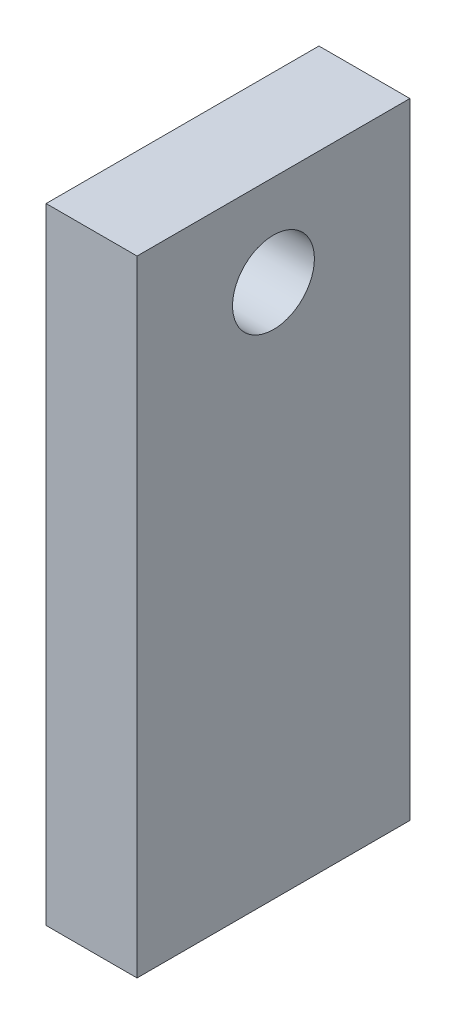
ISO-10303-21;
HEADER;
FILE_DESCRIPTION(('STEP AP214'),'2;1');
FILE_NAME('part.step','',(''),(''),'','','');
FILE_SCHEMA(('AUTOMOTIVE_DESIGN { 1 0 10303 214 1 1 1 1 }'));
ENDSEC;
DATA;
#1=APPLICATION_CONTEXT('core data for automotive mechanical design processes');
#2=APPLICATION_PROTOCOL_DEFINITION('international standard','automotive_design',2000,#1);
#3=PRODUCT_CONTEXT('',#1,'mechanical');
#4=PRODUCT('Part','Part','',(#3));
#5=PRODUCT_RELATED_PRODUCT_CATEGORY('part','',(#4));
#6=PRODUCT_DEFINITION_FORMATION('','',#4);
#7=PRODUCT_DEFINITION_CONTEXT('part definition',#1,'design');
#8=PRODUCT_DEFINITION('design','',#6,#7);
#9=PRODUCT_DEFINITION_SHAPE('','',#8);
#10=(LENGTH_UNIT() NAMED_UNIT(*) SI_UNIT(.MILLI.,.METRE.));
#11=(NAMED_UNIT(*) PLANE_ANGLE_UNIT() SI_UNIT($,.RADIAN.));
#12=(NAMED_UNIT(*) SI_UNIT($,.STERADIAN.) SOLID_ANGLE_UNIT());
#13=UNCERTAINTY_MEASURE_WITH_UNIT(LENGTH_MEASURE(1.E-05),#10,'distance_accuracy_value','');
#14=(GEOMETRIC_REPRESENTATION_CONTEXT(3) GLOBAL_UNCERTAINTY_ASSIGNED_CONTEXT((#13)) GLOBAL_UNIT_ASSIGNED_CONTEXT((#10,
#11,#12)) REPRESENTATION_CONTEXT('',''));
#15=CARTESIAN_POINT('',(0.,0.,0.));
#16=DIRECTION('',(0.,0.,1.));
#17=DIRECTION('',(1.,0.,0.));
#18=AXIS2_PLACEMENT_3D('',#15,#16,#17);
#19=CARTESIAN_POINT('',(100.,0.,0.));
#20=DIRECTION('',(1.,0.,0.));
#21=DIRECTION('',(0.,0.,-1.));
#22=AXIS2_PLACEMENT_3D('',#19,#20,#21);
#23=PLANE('',#22);
#24=DIRECTION('',(0.,-1.,0.));
#25=VECTOR('',#24,1.);
#26=CARTESIAN_POINT('',(100.,-343.75,150.));
#27=LINE('',#26,#25);
#28=CARTESIAN_POINT('',(100.,343.75,150.));
#29=VERTEX_POINT('',#28);
#30=CARTESIAN_POINT('',(100.,-343.75,150.));
#31=VERTEX_POINT('',#30);
#32=EDGE_CURVE('E100',#29,#31,#27,.T.);
#33=ORIENTED_EDGE('',*,*,#32,.T.);
#34=DIRECTION('',(0.,0.,-1.));
#35=VECTOR('',#34,1.);
#36=CARTESIAN_POINT('',(100.,-343.75,-150.));
#37=LINE('',#36,#35);
#38=CARTESIAN_POINT('',(100.,-343.75,-150.));
#39=VERTEX_POINT('',#38);
#40=EDGE_CURVE('E95',#31,#39,#37,.T.);
#41=ORIENTED_EDGE('',*,*,#40,.T.);
#42=DIRECTION('',(0.,1.,0.));
#43=VECTOR('',#42,1.);
#44=CARTESIAN_POINT('',(100.,-343.75,-150.));
#45=LINE('',#44,#43);
#46=CARTESIAN_POINT('',(100.,343.75,-150.));
#47=VERTEX_POINT('',#46);
#48=EDGE_CURVE('E98',#39,#47,#45,.T.);
#49=ORIENTED_EDGE('',*,*,#48,.T.);
#50=DIRECTION('',(0.,0.,1.));
#51=VECTOR('',#50,1.);
#52=CARTESIAN_POINT('',(100.,343.75,-150.));
#53=LINE('',#52,#51);
#54=EDGE_CURVE('E65',#47,#29,#53,.T.);
#55=ORIENTED_EDGE('',*,*,#54,.T.);
#56=EDGE_LOOP('',(#33,#41,#49,#55));
#57=FACE_BOUND('',#56,.T.);
#58=CARTESIAN_POINT('',(100.,243.75,0.));
#59=DIRECTION('',(1.,0.,0.));
#60=DIRECTION('',(0.,0.,-1.));
#61=AXIS2_PLACEMENT_3D('',#58,#59,#60);
#62=CIRCLE('',#61,45.);
#63=CARTESIAN_POINT('',(100.,243.75,-45.));
#64=VERTEX_POINT('',#63);
#65=EDGE_CURVE('E120',#64,#64,#62,.T.);
#66=ORIENTED_EDGE('',*,*,#65,.F.);
#67=EDGE_LOOP('',(#66));
#68=FACE_BOUND('',#67,.T.);
#69=ADVANCED_FACE('F47',(#57,#68),#23,.T.);
#70=CARTESIAN_POINT('',(0.,0.,0.));
#71=DIRECTION('',(1.,0.,0.));
#72=DIRECTION('',(0.,0.,-1.));
#73=AXIS2_PLACEMENT_3D('',#70,#71,#72);
#74=PLANE('',#73);
#75=DIRECTION('',(0.,-1.,0.));
#76=VECTOR('',#75,1.);
#77=CARTESIAN_POINT('',(0.,-343.75,150.));
#78=LINE('',#77,#76);
#79=CARTESIAN_POINT('',(0.,343.75,150.));
#80=VERTEX_POINT('',#79);
#81=CARTESIAN_POINT('',(0.,-343.75,150.));
#82=VERTEX_POINT('',#81);
#83=EDGE_CURVE('E116',#80,#82,#78,.T.);
#84=ORIENTED_EDGE('',*,*,#83,.F.);
#85=DIRECTION('',(0.,0.,1.));
#86=VECTOR('',#85,1.);
#87=CARTESIAN_POINT('',(0.,343.75,-150.));
#88=LINE('',#87,#86);
#89=CARTESIAN_POINT('',(0.,343.75,-150.));
#90=VERTEX_POINT('',#89);
#91=EDGE_CURVE('E88',#90,#80,#88,.T.);
#92=ORIENTED_EDGE('',*,*,#91,.F.);
#93=DIRECTION('',(0.,1.,0.));
#94=VECTOR('',#93,1.);
#95=CARTESIAN_POINT('',(0.,-343.75,-150.));
#96=LINE('',#95,#94);
#97=CARTESIAN_POINT('',(0.,-343.75,-150.));
#98=VERTEX_POINT('',#97);
#99=EDGE_CURVE('E82',#98,#90,#96,.T.);
#100=ORIENTED_EDGE('',*,*,#99,.F.);
#101=DIRECTION('',(0.,0.,-1.));
#102=VECTOR('',#101,1.);
#103=CARTESIAN_POINT('',(0.,-343.75,-150.));
#104=LINE('',#103,#102);
#105=EDGE_CURVE('E105',#82,#98,#104,.T.);
#106=ORIENTED_EDGE('',*,*,#105,.F.);
#107=EDGE_LOOP('',(#84,#92,#100,#106));
#108=FACE_BOUND('',#107,.T.);
#109=CARTESIAN_POINT('',(0.,243.75,0.));
#110=DIRECTION('',(1.,0.,0.));
#111=DIRECTION('',(0.,0.,-1.));
#112=AXIS2_PLACEMENT_3D('',#109,#110,#111);
#113=CIRCLE('',#112,45.);
#114=CARTESIAN_POINT('',(0.,243.75,-45.));
#115=VERTEX_POINT('',#114);
#116=EDGE_CURVE('E138',#115,#115,#113,.T.);
#117=ORIENTED_EDGE('',*,*,#116,.T.);
#118=EDGE_LOOP('',(#117));
#119=FACE_BOUND('',#118,.T.);
#120=ADVANCED_FACE('F133',(#108,#119),#74,.F.);
#121=CARTESIAN_POINT('',(100.,-343.75,150.));
#122=DIRECTION('',(0.,0.,-1.));
#123=DIRECTION('',(-1.,0.,0.));
#124=AXIS2_PLACEMENT_3D('',#121,#122,#123);
#125=PLANE('',#124);
#126=ORIENTED_EDGE('',*,*,#83,.T.);
#127=DIRECTION('',(-1.,0.,0.));
#128=VECTOR('',#127,1.);
#129=CARTESIAN_POINT('',(100.,-343.75,150.));
#130=LINE('',#129,#128);
#131=EDGE_CURVE('E11',#31,#82,#130,.T.);
#132=ORIENTED_EDGE('',*,*,#131,.F.);
#133=ORIENTED_EDGE('',*,*,#32,.F.);
#134=DIRECTION('',(-1.,0.,0.));
#135=VECTOR('',#134,1.);
#136=CARTESIAN_POINT('',(100.,343.75,150.));
#137=LINE('',#136,#135);
#138=EDGE_CURVE('E112',#29,#80,#137,.T.);
#139=ORIENTED_EDGE('',*,*,#138,.T.);
#140=EDGE_LOOP('',(#126,#132,#133,#139));
#141=FACE_BOUND('',#140,.T.);
#142=ADVANCED_FACE('F49',(#141),#125,.F.);
#143=CARTESIAN_POINT('',(100.,-343.75,-150.));
#144=DIRECTION('',(0.,1.,0.));
#145=DIRECTION('',(0.,0.,1.));
#146=AXIS2_PLACEMENT_3D('',#143,#144,#145);
#147=PLANE('',#146);
#148=ORIENTED_EDGE('',*,*,#105,.T.);
#149=DIRECTION('',(-1.,0.,0.));
#150=VECTOR('',#149,1.);
#151=CARTESIAN_POINT('',(100.,-343.75,-150.));
#152=LINE('',#151,#150);
#153=EDGE_CURVE('E57',#39,#98,#152,.T.);
#154=ORIENTED_EDGE('',*,*,#153,.F.);
#155=ORIENTED_EDGE('',*,*,#40,.F.);
#156=ORIENTED_EDGE('',*,*,#131,.T.);
#157=EDGE_LOOP('',(#148,#154,#155,#156));
#158=FACE_BOUND('',#157,.T.);
#159=ADVANCED_FACE('F104',(#158),#147,.F.);
#160=CARTESIAN_POINT('',(100.,-343.75,-150.));
#161=DIRECTION('',(0.,0.,1.));
#162=DIRECTION('',(1.,0.,0.));
#163=AXIS2_PLACEMENT_3D('',#160,#161,#162);
#164=PLANE('',#163);
#165=ORIENTED_EDGE('',*,*,#99,.T.);
#166=DIRECTION('',(-1.,0.,0.));
#167=VECTOR('',#166,1.);
#168=CARTESIAN_POINT('',(100.,343.75,-150.));
#169=LINE('',#168,#167);
#170=EDGE_CURVE('E107',#47,#90,#169,.T.);
#171=ORIENTED_EDGE('',*,*,#170,.F.);
#172=ORIENTED_EDGE('',*,*,#48,.F.);
#173=ORIENTED_EDGE('',*,*,#153,.T.);
#174=EDGE_LOOP('',(#165,#171,#172,#173));
#175=FACE_BOUND('',#174,.T.);
#176=ADVANCED_FACE('F108',(#175),#164,.F.);
#177=CARTESIAN_POINT('',(100.,343.75,-150.));
#178=DIRECTION('',(0.,-1.,0.));
#179=DIRECTION('',(0.,0.,-1.));
#180=AXIS2_PLACEMENT_3D('',#177,#178,#179);
#181=PLANE('',#180);
#182=ORIENTED_EDGE('',*,*,#91,.T.);
#183=ORIENTED_EDGE('',*,*,#138,.F.);
#184=ORIENTED_EDGE('',*,*,#54,.F.);
#185=ORIENTED_EDGE('',*,*,#170,.T.);
#186=EDGE_LOOP('',(#182,#183,#184,#185));
#187=FACE_BOUND('',#186,.T.);
#188=ADVANCED_FACE('F130',(#187),#181,.F.);
#189=CARTESIAN_POINT('',(100.,243.75,0.));
#190=DIRECTION('',(-1.,0.,0.));
#191=DIRECTION('',(0.,0.,1.));
#192=AXIS2_PLACEMENT_3D('',#189,#190,#191);
#193=CYLINDRICAL_SURFACE('',#192,45.);
#194=ORIENTED_EDGE('',*,*,#65,.T.);
#195=EDGE_LOOP('',(#194));
#196=FACE_BOUND('',#195,.T.);
#197=ORIENTED_EDGE('',*,*,#116,.F.);
#198=EDGE_LOOP('',(#197));
#199=FACE_BOUND('',#198,.T.);
#200=ADVANCED_FACE('F146',(#196,#199),#193,.F.);
#201=CLOSED_SHELL('',(#69,#120,#142,#159,#176,#188,#200));
#202=MANIFOLD_SOLID_BREP('B2',#201);
#203=ADVANCED_BREP_SHAPE_REPRESENTATION('',(#18,#202),#14);
#204=SHAPE_DEFINITION_REPRESENTATION(#9,#203);
ENDSEC;
END-ISO-10303-21;
